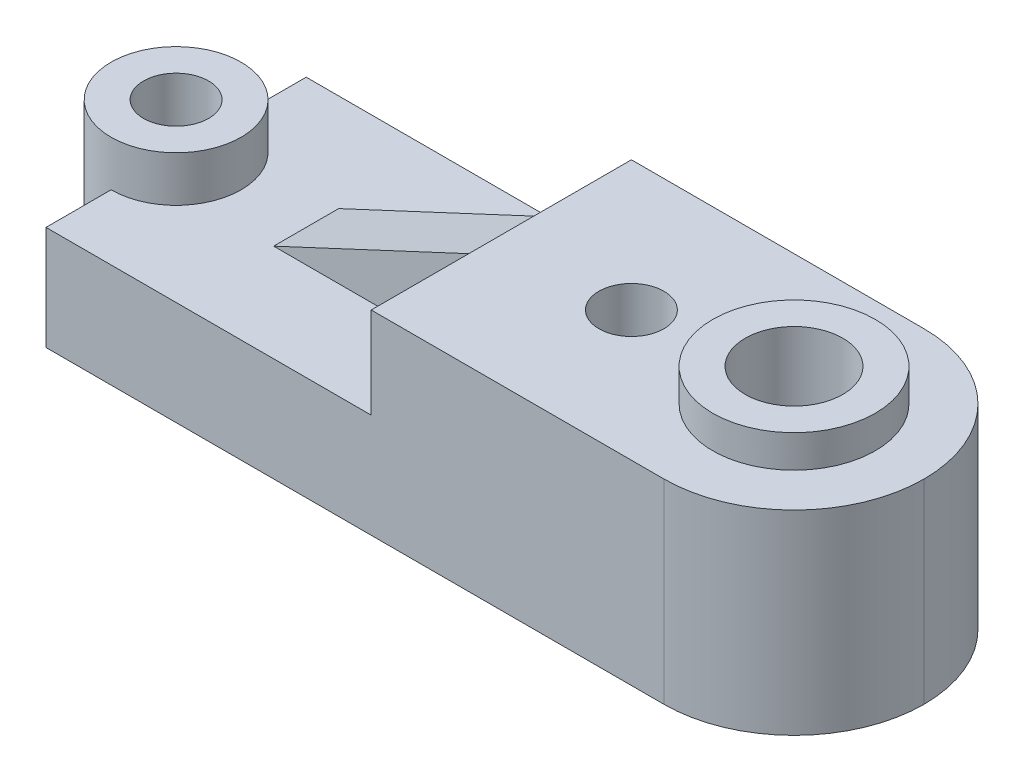
ISO-10303-21;
HEADER;
FILE_DESCRIPTION(('STEP AP214'),'2;1');
FILE_NAME('part.step','',(''),(''),'','','');
FILE_SCHEMA(('AUTOMOTIVE_DESIGN { 1 0 10303 214 1 1 1 1 }'));
ENDSEC;
DATA;
#1=APPLICATION_CONTEXT('core data for automotive mechanical design processes');
#2=APPLICATION_PROTOCOL_DEFINITION('international standard','automotive_design',2000,#1);
#3=PRODUCT_CONTEXT('',#1,'mechanical');
#4=PRODUCT('Part','Part','',(#3));
#5=PRODUCT_RELATED_PRODUCT_CATEGORY('part','',(#4));
#6=PRODUCT_DEFINITION_FORMATION('','',#4);
#7=PRODUCT_DEFINITION_CONTEXT('part definition',#1,'design');
#8=PRODUCT_DEFINITION('design','',#6,#7);
#9=PRODUCT_DEFINITION_SHAPE('','',#8);
#10=(LENGTH_UNIT() NAMED_UNIT(*) SI_UNIT(.MILLI.,.METRE.));
#11=(NAMED_UNIT(*) PLANE_ANGLE_UNIT() SI_UNIT($,.RADIAN.));
#12=(NAMED_UNIT(*) SI_UNIT($,.STERADIAN.) SOLID_ANGLE_UNIT());
#13=UNCERTAINTY_MEASURE_WITH_UNIT(LENGTH_MEASURE(1.E-05),#10,'distance_accuracy_value','');
#14=(GEOMETRIC_REPRESENTATION_CONTEXT(3) GLOBAL_UNCERTAINTY_ASSIGNED_CONTEXT((#13)) GLOBAL_UNIT_ASSIGNED_CONTEXT((#10,
#11,#12)) REPRESENTATION_CONTEXT('',''));
#15=CARTESIAN_POINT('',(0.,0.,0.));
#16=DIRECTION('',(0.,0.,1.));
#17=DIRECTION('',(1.,0.,0.));
#18=AXIS2_PLACEMENT_3D('',#15,#16,#17);
#19=CARTESIAN_POINT('',(0.,0.,0.));
#20=DIRECTION('',(0.,1.,0.));
#21=DIRECTION('',(0.,0.,1.));
#22=AXIS2_PLACEMENT_3D('',#19,#20,#21);
#23=PLANE('',#22);
#24=CARTESIAN_POINT('',(-57.5,0.,0.));
#25=DIRECTION('',(0.,1.,0.));
#26=DIRECTION('',(0.,0.,1.));
#27=AXIS2_PLACEMENT_3D('',#24,#25,#26);
#28=CIRCLE('',#27,7.5);
#29=CARTESIAN_POINT('',(-57.5,0.,7.5));
#30=VERTEX_POINT('',#29);
#31=EDGE_CURVE('E282',#30,#30,#28,.T.);
#32=ORIENTED_EDGE('',*,*,#31,.T.);
#33=EDGE_LOOP('',(#32));
#34=FACE_BOUND('',#33,.T.);
#35=DIRECTION('',(-1.,0.,0.));
#36=VECTOR('',#35,1.);
#37=CARTESIAN_POINT('',(-57.5,0.,-20.));
#38=LINE('',#37,#36);
#39=CARTESIAN_POINT('',(37.5,0.,-20.));
#40=VERTEX_POINT('',#39);
#41=CARTESIAN_POINT('',(-57.5,0.,-20.));
#42=VERTEX_POINT('',#41);
#43=EDGE_CURVE('E304',#40,#42,#38,.T.);
#44=ORIENTED_EDGE('',*,*,#43,.F.);
#45=CARTESIAN_POINT('',(37.5,0.,0.));
#46=DIRECTION('',(0.,1.,0.));
#47=DIRECTION('',(0.,0.,1.));
#48=AXIS2_PLACEMENT_3D('',#45,#46,#47);
#49=CIRCLE('',#48,20.);
#50=CARTESIAN_POINT('',(57.5,0.,0.));
#51=VERTEX_POINT('',#50);
#52=EDGE_CURVE('E335',#40,#51,#49,.F.);
#53=ORIENTED_EDGE('',*,*,#52,.T.);
#54=CARTESIAN_POINT('',(37.5,0.,0.));
#55=DIRECTION('',(0.,1.,0.));
#56=DIRECTION('',(0.,0.,1.));
#57=AXIS2_PLACEMENT_3D('',#54,#55,#56);
#58=CIRCLE('',#57,20.);
#59=CARTESIAN_POINT('',(37.5,0.,20.));
#60=VERTEX_POINT('',#59);
#61=EDGE_CURVE('E333',#51,#60,#58,.F.);
#62=ORIENTED_EDGE('',*,*,#61,.T.);
#63=DIRECTION('',(1.,0.,0.));
#64=VECTOR('',#63,1.);
#65=CARTESIAN_POINT('',(-57.5,0.,20.));
#66=LINE('',#65,#64);
#67=CARTESIAN_POINT('',(-57.5,0.,20.));
#68=VERTEX_POINT('',#67);
#69=EDGE_CURVE('E308',#68,#60,#66,.T.);
#70=ORIENTED_EDGE('',*,*,#69,.F.);
#71=DIRECTION('',(0.,0.,1.));
#72=VECTOR('',#71,1.);
#73=CARTESIAN_POINT('',(-57.5,0.,-20.));
#74=LINE('',#73,#72);
#75=CARTESIAN_POINT('',(-57.5,0.,10.));
#76=VERTEX_POINT('',#75);
#77=EDGE_CURVE('E317',#76,#68,#74,.T.);
#78=ORIENTED_EDGE('',*,*,#77,.F.);
#79=CARTESIAN_POINT('',(-57.5,0.,0.));
#80=DIRECTION('',(0.,1.,0.));
#81=DIRECTION('',(0.,0.,1.));
#82=AXIS2_PLACEMENT_3D('',#79,#80,#81);
#83=CIRCLE('',#82,10.);
#84=CARTESIAN_POINT('',(-57.5,0.,-10.));
#85=VERTEX_POINT('',#84);
#86=EDGE_CURVE('E291',#85,#76,#83,.T.);
#87=ORIENTED_EDGE('',*,*,#86,.F.);
#88=EDGE_CURVE('E318',#42,#85,#74,.T.);
#89=ORIENTED_EDGE('',*,*,#88,.F.);
#90=EDGE_LOOP('',(#44,#53,#62,#70,#78,#87,#89));
#91=FACE_BOUND('',#90,.T.);
#92=DIRECTION('',(1.,0.,0.));
#93=VECTOR('',#92,1.);
#94=CARTESIAN_POINT('',(-1.5,0.,10.));
#95=LINE('',#94,#93);
#96=CARTESIAN_POINT('',(-22.5,0.,10.));
#97=VERTEX_POINT('',#96);
#98=CARTESIAN_POINT('',(-1.5,0.,10.));
#99=VERTEX_POINT('',#98);
#100=EDGE_CURVE('E196',#97,#99,#95,.T.);
#101=ORIENTED_EDGE('',*,*,#100,.T.);
#102=DIRECTION('',(0.,0.,1.));
#103=VECTOR('',#102,1.);
#104=CARTESIAN_POINT('',(-1.5,0.,15.));
#105=LINE('',#104,#103);
#106=CARTESIAN_POINT('',(-1.5,0.,15.));
#107=VERTEX_POINT('',#106);
#108=EDGE_CURVE('E218',#99,#107,#105,.T.);
#109=ORIENTED_EDGE('',*,*,#108,.T.);
#110=DIRECTION('',(1.,0.,0.));
#111=VECTOR('',#110,1.);
#112=CARTESIAN_POINT('',(37.5,0.,15.));
#113=LINE('',#112,#111);
#114=CARTESIAN_POINT('',(37.5,0.,15.));
#115=VERTEX_POINT('',#114);
#116=EDGE_CURVE('E209',#107,#115,#113,.T.);
#117=ORIENTED_EDGE('',*,*,#116,.T.);
#118=CARTESIAN_POINT('',(37.5,0.,0.));
#119=DIRECTION('',(0.,1.,0.));
#120=DIRECTION('',(0.,0.,1.));
#121=AXIS2_PLACEMENT_3D('',#118,#119,#120);
#122=CIRCLE('',#121,15.);
#123=CARTESIAN_POINT('',(37.5,0.,-15.));
#124=VERTEX_POINT('',#123);
#125=EDGE_CURVE('E60',#115,#124,#122,.T.);
#126=ORIENTED_EDGE('',*,*,#125,.T.);
#127=DIRECTION('',(-1.,0.,0.));
#128=VECTOR('',#127,1.);
#129=CARTESIAN_POINT('',(-1.5,0.,-15.));
#130=LINE('',#129,#128);
#131=CARTESIAN_POINT('',(-1.5,0.,-15.));
#132=VERTEX_POINT('',#131);
#133=EDGE_CURVE('E199',#124,#132,#130,.T.);
#134=ORIENTED_EDGE('',*,*,#133,.T.);
#135=CARTESIAN_POINT('',(-1.5,0.,-10.));
#136=VERTEX_POINT('',#135);
#137=EDGE_CURVE('E219',#132,#136,#105,.T.);
#138=ORIENTED_EDGE('',*,*,#137,.T.);
#139=DIRECTION('',(-1.,0.,0.));
#140=VECTOR('',#139,1.);
#141=CARTESIAN_POINT('',(-22.5,0.,-10.));
#142=LINE('',#141,#140);
#143=CARTESIAN_POINT('',(-22.5,0.,-10.));
#144=VERTEX_POINT('',#143);
#145=EDGE_CURVE('E192',#136,#144,#142,.T.);
#146=ORIENTED_EDGE('',*,*,#145,.T.);
#147=CARTESIAN_POINT('',(-22.5,0.,0.));
#148=DIRECTION('',(0.,1.,0.));
#149=DIRECTION('',(0.,0.,1.));
#150=AXIS2_PLACEMENT_3D('',#147,#148,#149);
#151=CIRCLE('',#150,10.);
#152=EDGE_CURVE('E730',#144,#97,#151,.T.);
#153=ORIENTED_EDGE('',*,*,#152,.T.);
#154=EDGE_LOOP('',(#101,#109,#117,#126,#134,#138,#146,#153));
#155=FACE_BOUND('',#154,.T.);
#156=ADVANCED_FACE('F36',(#34,#91,#155),#23,.F.);
#157=CARTESIAN_POINT('',(-1.5,20.,15.));
#158=DIRECTION('',(1.,0.,0.));
#159=DIRECTION('',(0.,0.,-1.));
#160=AXIS2_PLACEMENT_3D('',#157,#158,#159);
#161=PLANE('',#160);
#162=ORIENTED_EDGE('',*,*,#108,.F.);
#163=DIRECTION('',(0.,-1.,0.));
#164=VECTOR('',#163,1.);
#165=CARTESIAN_POINT('',(-1.5,8.,10.));
#166=LINE('',#165,#164);
#167=CARTESIAN_POINT('',(-1.5,8.,10.));
#168=VERTEX_POINT('',#167);
#169=EDGE_CURVE('E197',#168,#99,#166,.T.);
#170=ORIENTED_EDGE('',*,*,#169,.F.);
#171=DIRECTION('',(0.,0.,-1.));
#172=VECTOR('',#171,1.);
#173=CARTESIAN_POINT('',(-1.5,8.,-10.));
#174=LINE('',#173,#172);
#175=CARTESIAN_POINT('',(-1.5,8.,-10.));
#176=VERTEX_POINT('',#175);
#177=EDGE_CURVE('E179',#168,#176,#174,.T.);
#178=ORIENTED_EDGE('',*,*,#177,.T.);
#179=DIRECTION('',(0.,-1.,0.));
#180=VECTOR('',#179,1.);
#181=CARTESIAN_POINT('',(-1.5,8.,-10.));
#182=LINE('',#181,#180);
#183=EDGE_CURVE('E201',#176,#136,#182,.T.);
#184=ORIENTED_EDGE('',*,*,#183,.T.);
#185=ORIENTED_EDGE('',*,*,#137,.F.);
#186=DIRECTION('',(0.,-1.,0.));
#187=VECTOR('',#186,1.);
#188=CARTESIAN_POINT('',(-1.5,20.,-15.));
#189=LINE('',#188,#187);
#190=CARTESIAN_POINT('',(-1.5,20.,-15.));
#191=VERTEX_POINT('',#190);
#192=EDGE_CURVE('E228',#191,#132,#189,.T.);
#193=ORIENTED_EDGE('',*,*,#192,.F.);
#194=DIRECTION('',(0.,0.,1.));
#195=VECTOR('',#194,1.);
#196=CARTESIAN_POINT('',(-1.5,20.,15.));
#197=LINE('',#196,#195);
#198=CARTESIAN_POINT('',(-1.5,20.,15.));
#199=VERTEX_POINT('',#198);
#200=EDGE_CURVE('E211',#191,#199,#197,.T.);
#201=ORIENTED_EDGE('',*,*,#200,.T.);
#202=DIRECTION('',(0.,-1.,0.));
#203=VECTOR('',#202,1.);
#204=CARTESIAN_POINT('',(-1.5,20.,15.));
#205=LINE('',#204,#203);
#206=EDGE_CURVE('E225',#199,#107,#205,.T.);
#207=ORIENTED_EDGE('',*,*,#206,.T.);
#208=EDGE_LOOP('',(#162,#170,#178,#184,#185,#193,#201,#207));
#209=FACE_BOUND('',#208,.T.);
#210=ADVANCED_FACE('F407',(#209),#161,.T.);
#211=CARTESIAN_POINT('',(-7.49999999999999,30.,-20.));
#212=DIRECTION('',(1.,0.,0.));
#213=DIRECTION('',(0.,0.,-1.));
#214=AXIS2_PLACEMENT_3D('',#211,#212,#213);
#215=PLANE('',#214);
#216=DIRECTION('',(0.,-1.,0.));
#217=VECTOR('',#216,1.);
#218=CARTESIAN_POINT('',(-7.49999999999999,30.,-5.));
#219=LINE('',#218,#217);
#220=CARTESIAN_POINT('',(-7.5,30.,-5.));
#221=VERTEX_POINT('',#220);
#222=CARTESIAN_POINT('',(-7.49999999999999,16.,-5.));
#223=VERTEX_POINT('',#222);
#224=EDGE_CURVE('E247',#221,#223,#219,.T.);
#225=ORIENTED_EDGE('',*,*,#224,.F.);
#226=DIRECTION('',(0.,0.,1.));
#227=VECTOR('',#226,1.);
#228=CARTESIAN_POINT('',(-7.49999999999999,30.,-20.));
#229=LINE('',#228,#227);
#230=CARTESIAN_POINT('',(-7.49999999999999,30.,-20.));
#231=VERTEX_POINT('',#230);
#232=EDGE_CURVE('E267',#231,#221,#229,.T.);
#233=ORIENTED_EDGE('',*,*,#232,.F.);
#234=DIRECTION('',(0.,-1.,0.));
#235=VECTOR('',#234,1.);
#236=CARTESIAN_POINT('',(-7.49999999999999,30.,-20.));
#237=LINE('',#236,#235);
#238=CARTESIAN_POINT('',(-7.49999999999999,16.,-20.));
#239=VERTEX_POINT('',#238);
#240=EDGE_CURVE('E279',#231,#239,#237,.T.);
#241=ORIENTED_EDGE('',*,*,#240,.T.);
#242=DIRECTION('',(0.,0.,1.));
#243=VECTOR('',#242,1.);
#244=CARTESIAN_POINT('',(-7.49999999999999,16.,-20.));
#245=LINE('',#244,#243);
#246=EDGE_CURVE('E266',#239,#223,#245,.T.);
#247=ORIENTED_EDGE('',*,*,#246,.T.);
#248=EDGE_LOOP('',(#225,#233,#241,#247));
#249=FACE_BOUND('',#248,.T.);
#250=ADVANCED_FACE('F405',(#249),#215,.F.);
#251=CARTESIAN_POINT('',(0.,16.,0.));
#252=DIRECTION('',(0.,1.,0.));
#253=DIRECTION('',(0.,0.,1.));
#254=AXIS2_PLACEMENT_3D('',#251,#252,#253);
#255=PLANE('',#254);
#256=DIRECTION('',(1.,0.,0.));
#257=VECTOR('',#256,1.);
#258=CARTESIAN_POINT('',(0.,16.,5.));
#259=LINE('',#258,#257);
#260=CARTESIAN_POINT('',(-37.5,16.,5.));
#261=VERTEX_POINT('',#260);
#262=CARTESIAN_POINT('',(-7.49999999999999,16.,5.));
#263=VERTEX_POINT('',#262);
#264=EDGE_CURVE('E258',#261,#263,#259,.T.);
#265=ORIENTED_EDGE('',*,*,#264,.F.);
#266=DIRECTION('',(0.,0.,-1.));
#267=VECTOR('',#266,1.);
#268=CARTESIAN_POINT('',(-37.5,16.,0.));
#269=LINE('',#268,#267);
#270=CARTESIAN_POINT('',(-37.5,16.,-5.));
#271=VERTEX_POINT('',#270);
#272=EDGE_CURVE('E260',#271,#261,#269,.F.);
#273=ORIENTED_EDGE('',*,*,#272,.F.);
#274=DIRECTION('',(1.,0.,0.));
#275=VECTOR('',#274,1.);
#276=CARTESIAN_POINT('',(0.,16.,-5.));
#277=LINE('',#276,#275);
#278=EDGE_CURVE('E252',#271,#223,#277,.T.);
#279=ORIENTED_EDGE('',*,*,#278,.T.);
#280=ORIENTED_EDGE('',*,*,#246,.F.);
#281=DIRECTION('',(-1.,0.,0.));
#282=VECTOR('',#281,1.);
#283=CARTESIAN_POINT('',(-57.5,16.,-20.));
#284=LINE('',#283,#282);
#285=CARTESIAN_POINT('',(-57.5,16.,-20.));
#286=VERTEX_POINT('',#285);
#287=EDGE_CURVE('E305',#239,#286,#284,.T.);
#288=ORIENTED_EDGE('',*,*,#287,.T.);
#289=DIRECTION('',(0.,0.,1.));
#290=VECTOR('',#289,1.);
#291=CARTESIAN_POINT('',(-57.5,16.,-20.));
#292=LINE('',#291,#290);
#293=CARTESIAN_POINT('',(-57.5,16.,-10.));
#294=VERTEX_POINT('',#293);
#295=EDGE_CURVE('E309',#286,#294,#292,.T.);
#296=ORIENTED_EDGE('',*,*,#295,.T.);
#297=CARTESIAN_POINT('',(-57.5,16.,0.));
#298=DIRECTION('',(0.,1.,0.));
#299=DIRECTION('',(0.,0.,1.));
#300=AXIS2_PLACEMENT_3D('',#297,#298,#299);
#301=CIRCLE('',#300,10.);
#302=CARTESIAN_POINT('',(-57.5,16.,10.));
#303=VERTEX_POINT('',#302);
#304=EDGE_CURVE('E295',#294,#303,#301,.F.);
#305=ORIENTED_EDGE('',*,*,#304,.T.);
#306=CARTESIAN_POINT('',(-57.5,16.,20.));
#307=VERTEX_POINT('',#306);
#308=EDGE_CURVE('E307',#303,#307,#292,.T.);
#309=ORIENTED_EDGE('',*,*,#308,.T.);
#310=DIRECTION('',(1.,0.,0.));
#311=VECTOR('',#310,1.);
#312=CARTESIAN_POINT('',(-57.5,16.,20.));
#313=LINE('',#312,#311);
#314=CARTESIAN_POINT('',(-7.49999999999999,16.,20.));
#315=VERTEX_POINT('',#314);
#316=EDGE_CURVE('E312',#307,#315,#313,.T.);
#317=ORIENTED_EDGE('',*,*,#316,.T.);
#318=EDGE_CURVE('E262',#263,#315,#245,.T.);
#319=ORIENTED_EDGE('',*,*,#318,.F.);
#320=EDGE_LOOP('',(#265,#273,#279,#280,#288,#296,#305,#309,#317,#319));
#321=FACE_BOUND('',#320,.T.);
#322=ADVANCED_FACE('F377',(#321),#255,.T.);
#323=CARTESIAN_POINT('',(-57.5,16.,-20.));
#324=DIRECTION('',(1.,0.,0.));
#325=DIRECTION('',(0.,0.,-1.));
#326=AXIS2_PLACEMENT_3D('',#323,#324,#325);
#327=PLANE('',#326);
#328=DIRECTION('',(0.,-1.,0.));
#329=VECTOR('',#328,1.);
#330=CARTESIAN_POINT('',(-57.5,23.,10.));
#331=LINE('',#330,#329);
#332=EDGE_CURVE('E301',#76,#303,#331,.F.);
#333=ORIENTED_EDGE('',*,*,#332,.F.);
#334=ORIENTED_EDGE('',*,*,#77,.T.);
#335=DIRECTION('',(0.,-1.,0.));
#336=VECTOR('',#335,1.);
#337=CARTESIAN_POINT('',(-57.5,16.,20.));
#338=LINE('',#337,#336);
#339=EDGE_CURVE('E315',#307,#68,#338,.T.);
#340=ORIENTED_EDGE('',*,*,#339,.F.);
#341=ORIENTED_EDGE('',*,*,#308,.F.);
#342=EDGE_LOOP('',(#333,#334,#340,#341));
#343=FACE_BOUND('',#342,.T.);
#344=ADVANCED_FACE('F365',(#343),#327,.F.);
#345=DIRECTION('',(0.,-1.,0.));
#346=VECTOR('',#345,1.);
#347=CARTESIAN_POINT('',(-57.5,23.,-10.));
#348=LINE('',#347,#346);
#349=EDGE_CURVE('E298',#294,#85,#348,.T.);
#350=ORIENTED_EDGE('',*,*,#349,.F.);
#351=ORIENTED_EDGE('',*,*,#295,.F.);
#352=DIRECTION('',(0.,-1.,0.));
#353=VECTOR('',#352,1.);
#354=CARTESIAN_POINT('',(-57.5,16.,-20.));
#355=LINE('',#354,#353);
#356=EDGE_CURVE('E324',#286,#42,#355,.T.);
#357=ORIENTED_EDGE('',*,*,#356,.T.);
#358=ORIENTED_EDGE('',*,*,#88,.T.);
#359=EDGE_LOOP('',(#350,#351,#357,#358));
#360=FACE_BOUND('',#359,.T.);
#361=ADVANCED_FACE('F374',(#360),#327,.F.);
#362=CARTESIAN_POINT('',(-57.5,16.,-20.));
#363=DIRECTION('',(0.,0.,1.));
#364=DIRECTION('',(1.,0.,0.));
#365=AXIS2_PLACEMENT_3D('',#362,#363,#364);
#366=PLANE('',#365);
#367=DIRECTION('',(-1.,0.,0.));
#368=VECTOR('',#367,1.);
#369=CARTESIAN_POINT('',(57.5,30.,-20.));
#370=LINE('',#369,#368);
#371=CARTESIAN_POINT('',(37.5,30.,-20.));
#372=VERTEX_POINT('',#371);
#373=EDGE_CURVE('E263',#372,#231,#370,.T.);
#374=ORIENTED_EDGE('',*,*,#373,.F.);
#375=DIRECTION('',(0.,-1.,0.));
#376=VECTOR('',#375,1.);
#377=CARTESIAN_POINT('',(37.5,16.,-20.));
#378=LINE('',#377,#376);
#379=EDGE_CURVE('E330',#372,#40,#378,.T.);
#380=ORIENTED_EDGE('',*,*,#379,.T.);
#381=ORIENTED_EDGE('',*,*,#43,.T.);
#382=ORIENTED_EDGE('',*,*,#356,.F.);
#383=ORIENTED_EDGE('',*,*,#287,.F.);
#384=ORIENTED_EDGE('',*,*,#240,.F.);
#385=EDGE_LOOP('',(#374,#380,#381,#382,#383,#384));
#386=FACE_BOUND('',#385,.T.);
#387=ADVANCED_FACE('F383',(#386),#366,.F.);
#388=CARTESIAN_POINT('',(-57.5,16.,20.));
#389=DIRECTION('',(0.,0.,-1.));
#390=DIRECTION('',(-1.,0.,0.));
#391=AXIS2_PLACEMENT_3D('',#388,#389,#390);
#392=PLANE('',#391);
#393=ORIENTED_EDGE('',*,*,#69,.T.);
#394=DIRECTION('',(0.,-1.,0.));
#395=VECTOR('',#394,1.);
#396=CARTESIAN_POINT('',(37.5,16.,20.));
#397=LINE('',#396,#395);
#398=CARTESIAN_POINT('',(37.5,30.,20.));
#399=VERTEX_POINT('',#398);
#400=EDGE_CURVE('E45',#60,#399,#397,.F.);
#401=ORIENTED_EDGE('',*,*,#400,.T.);
#402=DIRECTION('',(1.,0.,0.));
#403=VECTOR('',#402,1.);
#404=CARTESIAN_POINT('',(57.5,30.,20.));
#405=LINE('',#404,#403);
#406=CARTESIAN_POINT('',(-7.49999999999999,30.,20.));
#407=VERTEX_POINT('',#406);
#408=EDGE_CURVE('E270',#407,#399,#405,.T.);
#409=ORIENTED_EDGE('',*,*,#408,.F.);
#410=DIRECTION('',(0.,-1.,0.));
#411=VECTOR('',#410,1.);
#412=CARTESIAN_POINT('',(-7.49999999999999,30.,20.));
#413=LINE('',#412,#411);
#414=EDGE_CURVE('E274',#407,#315,#413,.T.);
#415=ORIENTED_EDGE('',*,*,#414,.T.);
#416=ORIENTED_EDGE('',*,*,#316,.F.);
#417=ORIENTED_EDGE('',*,*,#339,.T.);
#418=EDGE_LOOP('',(#393,#401,#409,#415,#416,#417));
#419=FACE_BOUND('',#418,.T.);
#420=ADVANCED_FACE('F358',(#419),#392,.F.);
#421=CARTESIAN_POINT('',(-57.5,23.,0.));
#422=DIRECTION('',(0.,-1.,0.));
#423=DIRECTION('',(0.,0.,-1.));
#424=AXIS2_PLACEMENT_3D('',#421,#422,#423);
#425=CYLINDRICAL_SURFACE('',#424,10.);
#426=ORIENTED_EDGE('',*,*,#86,.T.);
#427=ORIENTED_EDGE('',*,*,#332,.T.);
#428=ORIENTED_EDGE('',*,*,#304,.F.);
#429=ORIENTED_EDGE('',*,*,#349,.T.);
#430=EDGE_LOOP('',(#426,#427,#428,#429));
#431=FACE_BOUND('',#430,.T.);
#432=CARTESIAN_POINT('',(-57.5,23.,0.));
#433=DIRECTION('',(0.,1.,0.));
#434=DIRECTION('',(0.,0.,1.));
#435=AXIS2_PLACEMENT_3D('',#432,#433,#434);
#436=CIRCLE('',#435,10.);
#437=CARTESIAN_POINT('',(-57.5,23.,10.));
#438=VERTEX_POINT('',#437);
#439=EDGE_CURVE('E292',#438,#438,#436,.T.);
#440=ORIENTED_EDGE('',*,*,#439,.F.);
#441=EDGE_LOOP('',(#440));
#442=FACE_BOUND('',#441,.T.);
#443=ADVANCED_FACE('F369',(#431,#442),#425,.T.);
#444=CARTESIAN_POINT('',(-57.5,23.,0.));
#445=DIRECTION('',(0.,-1.,0.));
#446=DIRECTION('',(0.,0.,-1.));
#447=AXIS2_PLACEMENT_3D('',#444,#445,#446);
#448=CYLINDRICAL_SURFACE('',#447,5.);
#449=CARTESIAN_POINT('',(-57.5,10.,0.));
#450=DIRECTION('',(0.,1.,0.));
#451=DIRECTION('',(0.,0.,1.));
#452=AXIS2_PLACEMENT_3D('',#449,#450,#451);
#453=CIRCLE('',#452,5.);
#454=CARTESIAN_POINT('',(-57.5,10.,5.));
#455=VERTEX_POINT('',#454);
#456=EDGE_CURVE('E327',#455,#455,#453,.T.);
#457=ORIENTED_EDGE('',*,*,#456,.F.);
#458=EDGE_LOOP('',(#457));
#459=FACE_BOUND('',#458,.T.);
#460=CARTESIAN_POINT('',(-57.5,23.,0.));
#461=DIRECTION('',(0.,1.,0.));
#462=DIRECTION('',(0.,0.,1.));
#463=AXIS2_PLACEMENT_3D('',#460,#461,#462);
#464=CIRCLE('',#463,5.);
#465=CARTESIAN_POINT('',(-57.5,23.,5.));
#466=VERTEX_POINT('',#465);
#467=EDGE_CURVE('E286',#466,#466,#464,.T.);
#468=ORIENTED_EDGE('',*,*,#467,.T.);
#469=EDGE_LOOP('',(#468));
#470=FACE_BOUND('',#469,.T.);
#471=ADVANCED_FACE('F630',(#459,#470),#448,.F.);
#472=CARTESIAN_POINT('',(-57.5,23.,0.));
#473=DIRECTION('',(0.,1.,0.));
#474=DIRECTION('',(0.,0.,1.));
#475=AXIS2_PLACEMENT_3D('',#472,#473,#474);
#476=PLANE('',#475);
#477=ORIENTED_EDGE('',*,*,#439,.T.);
#478=EDGE_LOOP('',(#477));
#479=FACE_BOUND('',#478,.T.);
#480=ORIENTED_EDGE('',*,*,#467,.F.);
#481=EDGE_LOOP('',(#480));
#482=FACE_BOUND('',#481,.T.);
#483=ADVANCED_FACE('F620',(#479,#482),#476,.T.);
#484=CARTESIAN_POINT('',(-57.5,10.,0.));
#485=DIRECTION('',(0.,1.,0.));
#486=DIRECTION('',(0.,0.,1.));
#487=AXIS2_PLACEMENT_3D('',#484,#485,#486);
#488=PLANE('',#487);
#489=CARTESIAN_POINT('',(-57.5,10.,0.));
#490=DIRECTION('',(0.,1.,0.));
#491=DIRECTION('',(0.,0.,1.));
#492=AXIS2_PLACEMENT_3D('',#489,#490,#491);
#493=CIRCLE('',#492,7.5);
#494=CARTESIAN_POINT('',(-57.5,10.,7.5));
#495=VERTEX_POINT('',#494);
#496=EDGE_CURVE('E283',#495,#495,#493,.T.);
#497=ORIENTED_EDGE('',*,*,#496,.F.);
#498=EDGE_LOOP('',(#497));
#499=FACE_BOUND('',#498,.T.);
#500=ORIENTED_EDGE('',*,*,#456,.T.);
#501=EDGE_LOOP('',(#500));
#502=FACE_BOUND('',#501,.T.);
#503=ADVANCED_FACE('F609',(#499,#502),#488,.F.);
#504=CARTESIAN_POINT('',(-57.5,10.,0.));
#505=DIRECTION('',(0.,-1.,0.));
#506=DIRECTION('',(0.,0.,-1.));
#507=AXIS2_PLACEMENT_3D('',#504,#505,#506);
#508=CYLINDRICAL_SURFACE('',#507,7.5);
#509=ORIENTED_EDGE('',*,*,#496,.T.);
#510=EDGE_LOOP('',(#509));
#511=FACE_BOUND('',#510,.T.);
#512=ORIENTED_EDGE('',*,*,#31,.F.);
#513=EDGE_LOOP('',(#512));
#514=FACE_BOUND('',#513,.T.);
#515=ADVANCED_FACE('F419',(#511,#514),#508,.F.);
#516=CARTESIAN_POINT('',(-7.49999999999999,30.,5.));
#517=VERTEX_POINT('',#516);
#518=EDGE_CURVE('E265',#517,#407,#229,.T.);
#519=ORIENTED_EDGE('',*,*,#518,.F.);
#520=DIRECTION('',(0.,-1.,0.));
#521=VECTOR('',#520,1.);
#522=CARTESIAN_POINT('',(-7.49999999999999,30.,5.));
#523=LINE('',#522,#521);
#524=EDGE_CURVE('E255',#517,#263,#523,.T.);
#525=ORIENTED_EDGE('',*,*,#524,.T.);
#526=ORIENTED_EDGE('',*,*,#318,.T.);
#527=ORIENTED_EDGE('',*,*,#414,.F.);
#528=EDGE_LOOP('',(#519,#525,#526,#527));
#529=FACE_BOUND('',#528,.T.);
#530=ADVANCED_FACE('F391',(#529),#215,.F.);
#531=CARTESIAN_POINT('',(0.,30.,0.));
#532=DIRECTION('',(0.,-1.,0.));
#533=DIRECTION('',(0.,0.,-1.));
#534=AXIS2_PLACEMENT_3D('',#531,#532,#533);
#535=PLANE('',#534);
#536=CARTESIAN_POINT('',(12.5,30.,0.));
#537=DIRECTION('',(0.,1.,0.));
#538=DIRECTION('',(0.,0.,1.));
#539=AXIS2_PLACEMENT_3D('',#536,#537,#538);
#540=CIRCLE('',#539,5.);
#541=CARTESIAN_POINT('',(12.5,30.,5.));
#542=VERTEX_POINT('',#541);
#543=EDGE_CURVE('E235',#542,#542,#540,.T.);
#544=ORIENTED_EDGE('',*,*,#543,.F.);
#545=EDGE_LOOP('',(#544));
#546=FACE_BOUND('',#545,.T.);
#547=CARTESIAN_POINT('',(37.5,30.,0.));
#548=DIRECTION('',(0.,-1.,0.));
#549=DIRECTION('',(0.,0.,-1.));
#550=AXIS2_PLACEMENT_3D('',#547,#548,#549);
#551=CIRCLE('',#550,12.5);
#552=CARTESIAN_POINT('',(37.5,30.,-12.5));
#553=VERTEX_POINT('',#552);
#554=EDGE_CURVE('E11',#553,#553,#551,.F.);
#555=ORIENTED_EDGE('',*,*,#554,.F.);
#556=EDGE_LOOP('',(#555));
#557=FACE_BOUND('',#556,.T.);
#558=CARTESIAN_POINT('',(37.5,30.,0.));
#559=DIRECTION('',(0.,-1.,0.));
#560=DIRECTION('',(0.,0.,-1.));
#561=AXIS2_PLACEMENT_3D('',#558,#559,#560);
#562=CIRCLE('',#561,20.);
#563=CARTESIAN_POINT('',(57.5,30.,0.));
#564=VERTEX_POINT('',#563);
#565=EDGE_CURVE('E337',#399,#564,#562,.F.);
#566=ORIENTED_EDGE('',*,*,#565,.T.);
#567=CARTESIAN_POINT('',(37.5,30.,0.));
#568=DIRECTION('',(0.,-1.,0.));
#569=DIRECTION('',(0.,0.,-1.));
#570=AXIS2_PLACEMENT_3D('',#567,#568,#569);
#571=CIRCLE('',#570,20.);
#572=EDGE_CURVE('E339',#564,#372,#571,.F.);
#573=ORIENTED_EDGE('',*,*,#572,.T.);
#574=ORIENTED_EDGE('',*,*,#373,.T.);
#575=ORIENTED_EDGE('',*,*,#232,.T.);
#576=EDGE_CURVE('E271',#221,#517,#229,.T.);
#577=ORIENTED_EDGE('',*,*,#576,.T.);
#578=ORIENTED_EDGE('',*,*,#518,.T.);
#579=ORIENTED_EDGE('',*,*,#408,.T.);
#580=EDGE_LOOP('',(#566,#573,#574,#575,#577,#578,#579));
#581=FACE_BOUND('',#580,.T.);
#582=ADVANCED_FACE('F386',(#546,#557,#581),#535,.F.);
#583=CARTESIAN_POINT('',(-37.5,16.,0.));
#584=DIRECTION('',(0.422885465331124,-0.906183139995266,0.));
#585=DIRECTION('',(0.906183139995265,0.422885465331124,0.));
#586=AXIS2_PLACEMENT_3D('',#583,#584,#585);
#587=PLANE('',#586);
#588=DIRECTION('',(0.906183139995265,0.422885465331124,0.));
#589=VECTOR('',#588,1.);
#590=CARTESIAN_POINT('',(-37.5,16.,-5.));
#591=LINE('',#590,#589);
#592=EDGE_CURVE('E248',#271,#221,#591,.T.);
#593=ORIENTED_EDGE('',*,*,#592,.F.);
#594=ORIENTED_EDGE('',*,*,#272,.T.);
#595=DIRECTION('',(0.906183139995265,0.422885465331124,0.));
#596=VECTOR('',#595,1.);
#597=CARTESIAN_POINT('',(-37.5,16.,5.));
#598=LINE('',#597,#596);
#599=EDGE_CURVE('E245',#261,#517,#598,.T.);
#600=ORIENTED_EDGE('',*,*,#599,.T.);
#601=ORIENTED_EDGE('',*,*,#576,.F.);
#602=EDGE_LOOP('',(#593,#594,#600,#601));
#603=FACE_BOUND('',#602,.T.);
#604=ADVANCED_FACE('F400',(#603),#587,.F.);
#605=CARTESIAN_POINT('',(-5.,15.,5.));
#606=DIRECTION('',(0.,0.,1.));
#607=DIRECTION('',(1.,0.,0.));
#608=AXIS2_PLACEMENT_3D('',#605,#606,#607);
#609=PLANE('',#608);
#610=ORIENTED_EDGE('',*,*,#599,.F.);
#611=ORIENTED_EDGE('',*,*,#264,.T.);
#612=ORIENTED_EDGE('',*,*,#524,.F.);
#613=EDGE_LOOP('',(#610,#611,#612));
#614=FACE_BOUND('',#613,.T.);
#615=ADVANCED_FACE('F397',(#614),#609,.T.);
#616=CARTESIAN_POINT('',(-5.,15.,-5.));
#617=DIRECTION('',(0.,0.,1.));
#618=DIRECTION('',(1.,0.,0.));
#619=AXIS2_PLACEMENT_3D('',#616,#617,#618);
#620=PLANE('',#619);
#621=ORIENTED_EDGE('',*,*,#278,.F.);
#622=ORIENTED_EDGE('',*,*,#592,.T.);
#623=ORIENTED_EDGE('',*,*,#224,.T.);
#624=EDGE_LOOP('',(#621,#622,#623));
#625=FACE_BOUND('',#624,.T.);
#626=ADVANCED_FACE('F403',(#625),#620,.F.);
#627=CARTESIAN_POINT('',(37.5,16.,0.));
#628=DIRECTION('',(0.,-1.,0.));
#629=DIRECTION('',(0.,0.,-1.));
#630=AXIS2_PLACEMENT_3D('',#627,#628,#629);
#631=CYLINDRICAL_SURFACE('',#630,20.);
#632=DIRECTION('',(0.,-1.,0.));
#633=VECTOR('',#632,1.);
#634=CARTESIAN_POINT('',(57.5,16.,0.));
#635=LINE('',#634,#633);
#636=EDGE_CURVE('E244',#564,#51,#635,.T.);
#637=ORIENTED_EDGE('',*,*,#636,.F.);
#638=ORIENTED_EDGE('',*,*,#565,.F.);
#639=ORIENTED_EDGE('',*,*,#400,.F.);
#640=ORIENTED_EDGE('',*,*,#61,.F.);
#641=EDGE_LOOP('',(#637,#638,#639,#640));
#642=FACE_BOUND('',#641,.T.);
#643=ADVANCED_FACE('F38',(#642),#631,.T.);
#644=CARTESIAN_POINT('',(37.5,16.,0.));
#645=DIRECTION('',(0.,-1.,0.));
#646=DIRECTION('',(0.,0.,-1.));
#647=AXIS2_PLACEMENT_3D('',#644,#645,#646);
#648=CYLINDRICAL_SURFACE('',#647,20.);
#649=ORIENTED_EDGE('',*,*,#572,.F.);
#650=ORIENTED_EDGE('',*,*,#636,.T.);
#651=ORIENTED_EDGE('',*,*,#52,.F.);
#652=ORIENTED_EDGE('',*,*,#379,.F.);
#653=EDGE_LOOP('',(#649,#650,#651,#652));
#654=FACE_BOUND('',#653,.T.);
#655=ADVANCED_FACE('F346',(#654),#648,.T.);
#656=CARTESIAN_POINT('',(37.5,35.,0.));
#657=DIRECTION('',(0.,1.,0.));
#658=DIRECTION('',(0.,0.,1.));
#659=AXIS2_PLACEMENT_3D('',#656,#657,#658);
#660=PLANE('',#659);
#661=CARTESIAN_POINT('',(37.5,35.,0.));
#662=DIRECTION('',(0.,1.,0.));
#663=DIRECTION('',(0.,0.,1.));
#664=AXIS2_PLACEMENT_3D('',#661,#662,#663);
#665=CIRCLE('',#664,12.5);
#666=CARTESIAN_POINT('',(37.5,35.,12.5));
#667=VERTEX_POINT('',#666);
#668=EDGE_CURVE('E241',#667,#667,#665,.T.);
#669=ORIENTED_EDGE('',*,*,#668,.T.);
#670=EDGE_LOOP('',(#669));
#671=FACE_BOUND('',#670,.T.);
#672=CARTESIAN_POINT('',(37.5,35.,0.));
#673=DIRECTION('',(0.,1.,0.));
#674=DIRECTION('',(0.,0.,1.));
#675=AXIS2_PLACEMENT_3D('',#672,#673,#674);
#676=CIRCLE('',#675,7.5);
#677=CARTESIAN_POINT('',(37.5,35.,7.5));
#678=VERTEX_POINT('',#677);
#679=EDGE_CURVE('E238',#678,#678,#676,.T.);
#680=ORIENTED_EDGE('',*,*,#679,.F.);
#681=EDGE_LOOP('',(#680));
#682=FACE_BOUND('',#681,.T.);
#683=ADVANCED_FACE('F433',(#671,#682),#660,.T.);
#684=CARTESIAN_POINT('',(37.5,35.,0.));
#685=DIRECTION('',(0.,-1.,0.));
#686=DIRECTION('',(0.,0.,-1.));
#687=AXIS2_PLACEMENT_3D('',#684,#685,#686);
#688=CYLINDRICAL_SURFACE('',#687,12.5);
#689=ORIENTED_EDGE('',*,*,#668,.F.);
#690=EDGE_LOOP('',(#689));
#691=FACE_BOUND('',#690,.T.);
#692=ORIENTED_EDGE('',*,*,#554,.T.);
#693=EDGE_LOOP('',(#692));
#694=FACE_BOUND('',#693,.T.);
#695=ADVANCED_FACE('F438',(#691,#694),#688,.T.);
#696=CARTESIAN_POINT('',(37.5,35.,0.));
#697=DIRECTION('',(0.,-1.,0.));
#698=DIRECTION('',(0.,0.,-1.));
#699=AXIS2_PLACEMENT_3D('',#696,#697,#698);
#700=CYLINDRICAL_SURFACE('',#699,7.5);
#701=CARTESIAN_POINT('',(37.5,20.,0.));
#702=DIRECTION('',(0.,1.,0.));
#703=DIRECTION('',(0.,0.,1.));
#704=AXIS2_PLACEMENT_3D('',#701,#702,#703);
#705=CIRCLE('',#704,7.5);
#706=CARTESIAN_POINT('',(37.5,20.,7.5));
#707=VERTEX_POINT('',#706);
#708=EDGE_CURVE('E232',#707,#707,#705,.T.);
#709=ORIENTED_EDGE('',*,*,#708,.F.);
#710=EDGE_LOOP('',(#709));
#711=FACE_BOUND('',#710,.T.);
#712=ORIENTED_EDGE('',*,*,#679,.T.);
#713=EDGE_LOOP('',(#712));
#714=FACE_BOUND('',#713,.T.);
#715=ADVANCED_FACE('F461',(#711,#714),#700,.F.);
#716=CARTESIAN_POINT('',(12.5,0.,0.));
#717=DIRECTION('',(0.,1.,0.));
#718=DIRECTION('',(0.,0.,1.));
#719=AXIS2_PLACEMENT_3D('',#716,#717,#718);
#720=CYLINDRICAL_SURFACE('',#719,5.);
#721=CARTESIAN_POINT('',(12.5,20.,0.));
#722=DIRECTION('',(0.,1.,0.));
#723=DIRECTION('',(0.,0.,1.));
#724=AXIS2_PLACEMENT_3D('',#721,#722,#723);
#725=CIRCLE('',#724,5.);
#726=CARTESIAN_POINT('',(12.5,20.,5.));
#727=VERTEX_POINT('',#726);
#728=EDGE_CURVE('E40',#727,#727,#725,.F.);
#729=ORIENTED_EDGE('',*,*,#728,.T.);
#730=EDGE_LOOP('',(#729));
#731=FACE_BOUND('',#730,.T.);
#732=ORIENTED_EDGE('',*,*,#543,.T.);
#733=EDGE_LOOP('',(#732));
#734=FACE_BOUND('',#733,.T.);
#735=ADVANCED_FACE('F466',(#731,#734),#720,.F.);
#736=CARTESIAN_POINT('',(37.5,20.,0.));
#737=DIRECTION('',(0.,1.,0.));
#738=DIRECTION('',(0.,0.,1.));
#739=AXIS2_PLACEMENT_3D('',#736,#737,#738);
#740=PLANE('',#739);
#741=ORIENTED_EDGE('',*,*,#708,.T.);
#742=EDGE_LOOP('',(#741));
#743=FACE_BOUND('',#742,.T.);
#744=CARTESIAN_POINT('',(37.5,20.,0.));
#745=DIRECTION('',(0.,1.,0.));
#746=DIRECTION('',(0.,0.,1.));
#747=AXIS2_PLACEMENT_3D('',#744,#745,#746);
#748=CIRCLE('',#747,15.);
#749=CARTESIAN_POINT('',(37.5,20.,15.));
#750=VERTEX_POINT('',#749);
#751=CARTESIAN_POINT('',(37.5,20.,-15.));
#752=VERTEX_POINT('',#751);
#753=EDGE_CURVE('E205',#750,#752,#748,.T.);
#754=ORIENTED_EDGE('',*,*,#753,.F.);
#755=DIRECTION('',(1.,0.,0.));
#756=VECTOR('',#755,1.);
#757=CARTESIAN_POINT('',(37.5,20.,15.));
#758=LINE('',#757,#756);
#759=EDGE_CURVE('E213',#199,#750,#758,.T.);
#760=ORIENTED_EDGE('',*,*,#759,.F.);
#761=ORIENTED_EDGE('',*,*,#200,.F.);
#762=DIRECTION('',(-1.,0.,0.));
#763=VECTOR('',#762,1.);
#764=CARTESIAN_POINT('',(-1.5,20.,-15.));
#765=LINE('',#764,#763);
#766=EDGE_CURVE('E208',#752,#191,#765,.T.);
#767=ORIENTED_EDGE('',*,*,#766,.F.);
#768=EDGE_LOOP('',(#754,#760,#761,#767));
#769=FACE_BOUND('',#768,.T.);
#770=ORIENTED_EDGE('',*,*,#728,.F.);
#771=EDGE_LOOP('',(#770));
#772=FACE_BOUND('',#771,.T.);
#773=ADVANCED_FACE('F473',(#743,#769,#772),#740,.F.);
#774=CARTESIAN_POINT('',(37.5,20.,0.));
#775=DIRECTION('',(0.,-1.,0.));
#776=DIRECTION('',(0.,0.,-1.));
#777=AXIS2_PLACEMENT_3D('',#774,#775,#776);
#778=CYLINDRICAL_SURFACE('',#777,15.);
#779=ORIENTED_EDGE('',*,*,#125,.F.);
#780=DIRECTION('',(0.,-1.,0.));
#781=VECTOR('',#780,1.);
#782=CARTESIAN_POINT('',(37.5,20.,15.));
#783=LINE('',#782,#781);
#784=EDGE_CURVE('E214',#750,#115,#783,.T.);
#785=ORIENTED_EDGE('',*,*,#784,.F.);
#786=ORIENTED_EDGE('',*,*,#753,.T.);
#787=DIRECTION('',(0.,-1.,0.));
#788=VECTOR('',#787,1.);
#789=CARTESIAN_POINT('',(37.5,20.,-15.));
#790=LINE('',#789,#788);
#791=EDGE_CURVE('E230',#752,#124,#790,.T.);
#792=ORIENTED_EDGE('',*,*,#791,.T.);
#793=EDGE_LOOP('',(#779,#785,#786,#792));
#794=FACE_BOUND('',#793,.T.);
#795=ADVANCED_FACE('F475',(#794),#778,.F.);
#796=CARTESIAN_POINT('',(-1.5,20.,-15.));
#797=DIRECTION('',(0.,0.,1.));
#798=DIRECTION('',(1.,0.,0.));
#799=AXIS2_PLACEMENT_3D('',#796,#797,#798);
#800=PLANE('',#799);
#801=ORIENTED_EDGE('',*,*,#133,.F.);
#802=ORIENTED_EDGE('',*,*,#791,.F.);
#803=ORIENTED_EDGE('',*,*,#766,.T.);
#804=ORIENTED_EDGE('',*,*,#192,.T.);
#805=EDGE_LOOP('',(#801,#802,#803,#804));
#806=FACE_BOUND('',#805,.T.);
#807=ADVANCED_FACE('F478',(#806),#800,.T.);
#808=CARTESIAN_POINT('',(37.5,20.,15.));
#809=DIRECTION('',(0.,0.,-1.));
#810=DIRECTION('',(-1.,0.,0.));
#811=AXIS2_PLACEMENT_3D('',#808,#809,#810);
#812=PLANE('',#811);
#813=ORIENTED_EDGE('',*,*,#116,.F.);
#814=ORIENTED_EDGE('',*,*,#206,.F.);
#815=ORIENTED_EDGE('',*,*,#759,.T.);
#816=ORIENTED_EDGE('',*,*,#784,.T.);
#817=EDGE_LOOP('',(#813,#814,#815,#816));
#818=FACE_BOUND('',#817,.T.);
#819=ADVANCED_FACE('F480',(#818),#812,.T.);
#820=CARTESIAN_POINT('',(-22.5,8.,0.));
#821=DIRECTION('',(0.,-1.,0.));
#822=DIRECTION('',(0.,0.,-1.));
#823=AXIS2_PLACEMENT_3D('',#820,#821,#822);
#824=CYLINDRICAL_SURFACE('',#823,10.);
#825=ORIENTED_EDGE('',*,*,#152,.F.);
#826=DIRECTION('',(0.,-1.,0.));
#827=VECTOR('',#826,1.);
#828=CARTESIAN_POINT('',(-22.5,8.,-10.));
#829=LINE('',#828,#827);
#830=CARTESIAN_POINT('',(-22.5,8.,-10.));
#831=VERTEX_POINT('',#830);
#832=EDGE_CURVE('E191',#831,#144,#829,.T.);
#833=ORIENTED_EDGE('',*,*,#832,.F.);
#834=CARTESIAN_POINT('',(-22.5,8.,0.));
#835=DIRECTION('',(0.,1.,0.));
#836=DIRECTION('',(0.,0.,1.));
#837=AXIS2_PLACEMENT_3D('',#834,#835,#836);
#838=CIRCLE('',#837,10.);
#839=CARTESIAN_POINT('',(-22.5,8.,10.));
#840=VERTEX_POINT('',#839);
#841=EDGE_CURVE('E177',#831,#840,#838,.T.);
#842=ORIENTED_EDGE('',*,*,#841,.T.);
#843=DIRECTION('',(0.,-1.,0.));
#844=VECTOR('',#843,1.);
#845=CARTESIAN_POINT('',(-22.5,8.,10.));
#846=LINE('',#845,#844);
#847=EDGE_CURVE('E189',#840,#97,#846,.T.);
#848=ORIENTED_EDGE('',*,*,#847,.T.);
#849=EDGE_LOOP('',(#825,#833,#842,#848));
#850=FACE_BOUND('',#849,.T.);
#851=ADVANCED_FACE('F188',(#850),#824,.F.);
#852=CARTESIAN_POINT('',(-1.5,8.,10.));
#853=DIRECTION('',(0.,0.,-1.));
#854=DIRECTION('',(-1.,0.,0.));
#855=AXIS2_PLACEMENT_3D('',#852,#853,#854);
#856=PLANE('',#855);
#857=ORIENTED_EDGE('',*,*,#100,.F.);
#858=ORIENTED_EDGE('',*,*,#847,.F.);
#859=DIRECTION('',(1.,0.,0.));
#860=VECTOR('',#859,1.);
#861=CARTESIAN_POINT('',(-1.5,8.,10.));
#862=LINE('',#861,#860);
#863=EDGE_CURVE('E174',#840,#168,#862,.T.);
#864=ORIENTED_EDGE('',*,*,#863,.T.);
#865=ORIENTED_EDGE('',*,*,#169,.T.);
#866=EDGE_LOOP('',(#857,#858,#864,#865));
#867=FACE_BOUND('',#866,.T.);
#868=ADVANCED_FACE('F194',(#867),#856,.T.);
#869=CARTESIAN_POINT('',(-22.5,8.,-10.));
#870=DIRECTION('',(0.,0.,1.));
#871=DIRECTION('',(1.,0.,0.));
#872=AXIS2_PLACEMENT_3D('',#869,#870,#871);
#873=PLANE('',#872);
#874=ORIENTED_EDGE('',*,*,#145,.F.);
#875=ORIENTED_EDGE('',*,*,#183,.F.);
#876=DIRECTION('',(-1.,0.,0.));
#877=VECTOR('',#876,1.);
#878=CARTESIAN_POINT('',(-22.5,8.,-10.));
#879=LINE('',#878,#877);
#880=EDGE_CURVE('E52',#176,#831,#879,.T.);
#881=ORIENTED_EDGE('',*,*,#880,.T.);
#882=ORIENTED_EDGE('',*,*,#832,.T.);
#883=EDGE_LOOP('',(#874,#875,#881,#882));
#884=FACE_BOUND('',#883,.T.);
#885=ADVANCED_FACE('F493',(#884),#873,.T.);
#886=CARTESIAN_POINT('',(-22.5,8.,0.));
#887=DIRECTION('',(0.,1.,0.));
#888=DIRECTION('',(0.,0.,1.));
#889=AXIS2_PLACEMENT_3D('',#886,#887,#888);
#890=PLANE('',#889);
#891=ORIENTED_EDGE('',*,*,#841,.F.);
#892=ORIENTED_EDGE('',*,*,#880,.F.);
#893=ORIENTED_EDGE('',*,*,#177,.F.);
#894=ORIENTED_EDGE('',*,*,#863,.F.);
#895=EDGE_LOOP('',(#891,#892,#893,#894));
#896=FACE_BOUND('',#895,.T.);
#897=ADVANCED_FACE('F176',(#896),#890,.F.);
#898=CLOSED_SHELL('',(#156,#210,#250,#322,#344,#361,#387,#420,#443,#471,#483,#503,#515,#530,
#582,#604,#615,#626,#643,#655,#683,#695,#715,#735,#773,#795,#807,#819,#851,#868,#885,#897));
#899=MANIFOLD_SOLID_BREP('B2',#898);
#900=ADVANCED_BREP_SHAPE_REPRESENTATION('',(#18,#899),#14);
#901=SHAPE_DEFINITION_REPRESENTATION(#9,#900);
ENDSEC;
END-ISO-10303-21;
